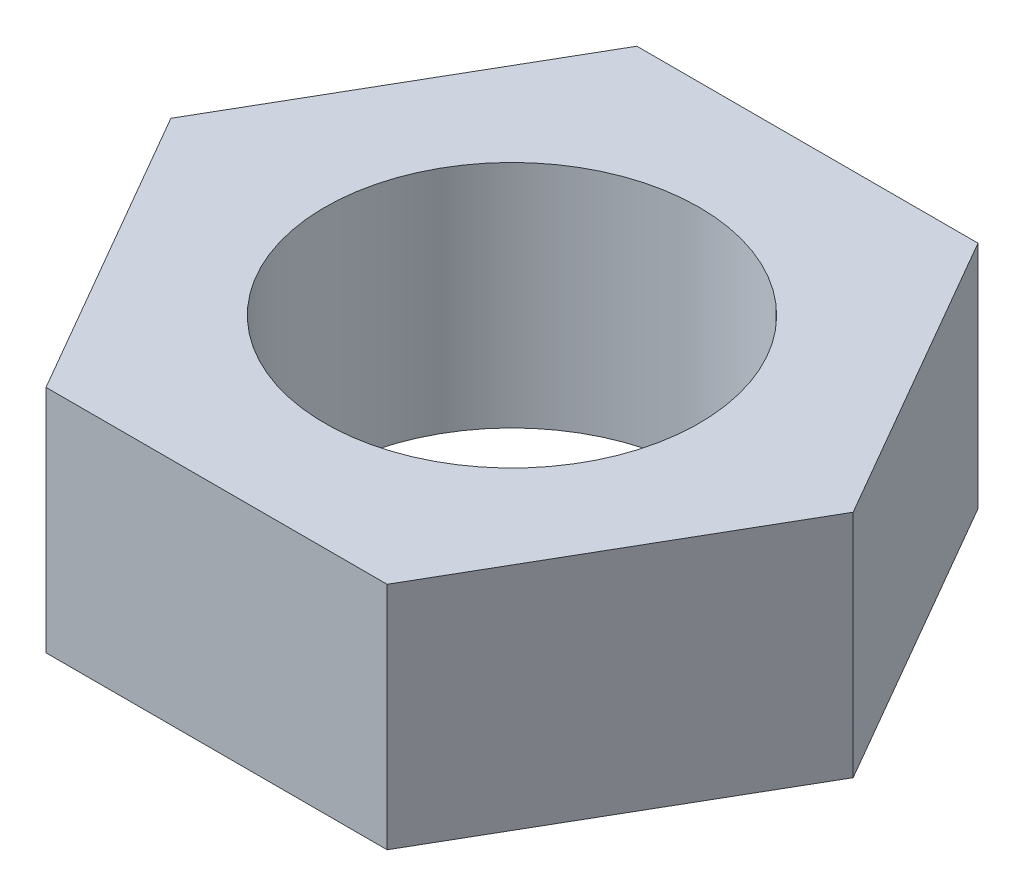
ISO-10303-21;
HEADER;
FILE_DESCRIPTION(('STEP AP214'),'2;1');
FILE_NAME('part.step','',(''),(''),'','','');
FILE_SCHEMA(('AUTOMOTIVE_DESIGN { 1 0 10303 214 1 1 1 1 }'));
ENDSEC;
DATA;
#1=APPLICATION_CONTEXT('core data for automotive mechanical design processes');
#2=APPLICATION_PROTOCOL_DEFINITION('international standard','automotive_design',2000,#1);
#3=PRODUCT_CONTEXT('',#1,'mechanical');
#4=PRODUCT('Part','Part','',(#3));
#5=PRODUCT_RELATED_PRODUCT_CATEGORY('part','',(#4));
#6=PRODUCT_DEFINITION_FORMATION('','',#4);
#7=PRODUCT_DEFINITION_CONTEXT('part definition',#1,'design');
#8=PRODUCT_DEFINITION('design','',#6,#7);
#9=PRODUCT_DEFINITION_SHAPE('','',#8);
#10=(LENGTH_UNIT() NAMED_UNIT(*) SI_UNIT(.MILLI.,.METRE.));
#11=(NAMED_UNIT(*) PLANE_ANGLE_UNIT() SI_UNIT($,.RADIAN.));
#12=(NAMED_UNIT(*) SI_UNIT($,.STERADIAN.) SOLID_ANGLE_UNIT());
#13=UNCERTAINTY_MEASURE_WITH_UNIT(LENGTH_MEASURE(1.E-05),#10,'distance_accuracy_value','');
#14=(GEOMETRIC_REPRESENTATION_CONTEXT(3) GLOBAL_UNCERTAINTY_ASSIGNED_CONTEXT((#13)) GLOBAL_UNIT_ASSIGNED_CONTEXT((#10,
#11,#12)) REPRESENTATION_CONTEXT('',''));
#15=CARTESIAN_POINT('',(0.,0.,0.));
#16=DIRECTION('',(0.,0.,1.));
#17=DIRECTION('',(1.,0.,0.));
#18=AXIS2_PLACEMENT_3D('',#15,#16,#17);
#19=CARTESIAN_POINT('',(0.,4.3,0.));
#20=DIRECTION('',(0.,1.,0.));
#21=DIRECTION('',(0.,0.,1.));
#22=AXIS2_PLACEMENT_3D('',#19,#20,#21);
#23=PLANE('',#22);
#24=DIRECTION('',(1.,0.,0.));
#25=VECTOR('',#24,1.);
#26=CARTESIAN_POINT('',(-3.18986023727268,4.3,5.525));
#27=LINE('',#26,#25);
#28=CARTESIAN_POINT('',(-3.18986023727268,4.3,5.525));
#29=VERTEX_POINT('',#28);
#30=CARTESIAN_POINT('',(3.18986023727268,4.3,5.525));
#31=VERTEX_POINT('',#30);
#32=EDGE_CURVE('E129',#29,#31,#27,.T.);
#33=ORIENTED_EDGE('',*,*,#32,.T.);
#34=DIRECTION('',(0.5,0.,-0.866025403784438));
#35=VECTOR('',#34,1.);
#36=CARTESIAN_POINT('',(3.18986023727268,4.3,5.525));
#37=LINE('',#36,#35);
#38=CARTESIAN_POINT('',(6.37972047454537,4.3,0.));
#39=VERTEX_POINT('',#38);
#40=EDGE_CURVE('E87',#31,#39,#37,.T.);
#41=ORIENTED_EDGE('',*,*,#40,.T.);
#42=DIRECTION('',(-0.5,0.,-0.866025403784438));
#43=VECTOR('',#42,1.);
#44=CARTESIAN_POINT('',(6.37972047454537,4.3,0.));
#45=LINE('',#44,#43);
#46=CARTESIAN_POINT('',(3.18986023727268,4.3,-5.525));
#47=VERTEX_POINT('',#46);
#48=EDGE_CURVE('E100',#39,#47,#45,.T.);
#49=ORIENTED_EDGE('',*,*,#48,.T.);
#50=DIRECTION('',(-1.,0.,0.));
#51=VECTOR('',#50,1.);
#52=CARTESIAN_POINT('',(3.18986023727268,4.3,-5.525));
#53=LINE('',#52,#51);
#54=CARTESIAN_POINT('',(-3.18986023727268,4.3,-5.525));
#55=VERTEX_POINT('',#54);
#56=EDGE_CURVE('E94',#47,#55,#53,.T.);
#57=ORIENTED_EDGE('',*,*,#56,.T.);
#58=DIRECTION('',(-0.5,0.,0.866025403784438));
#59=VECTOR('',#58,1.);
#60=CARTESIAN_POINT('',(-3.18986023727268,4.3,-5.525));
#61=LINE('',#60,#59);
#62=CARTESIAN_POINT('',(-6.37972047454537,4.3,0.));
#63=VERTEX_POINT('',#62);
#64=EDGE_CURVE('E98',#55,#63,#61,.T.);
#65=ORIENTED_EDGE('',*,*,#64,.T.);
#66=DIRECTION('',(0.5,0.,0.866025403784438));
#67=VECTOR('',#66,1.);
#68=CARTESIAN_POINT('',(-6.37972047454537,4.3,0.));
#69=LINE('',#68,#67);
#70=EDGE_CURVE('E50',#63,#29,#69,.T.);
#71=ORIENTED_EDGE('',*,*,#70,.T.);
#72=EDGE_LOOP('',(#33,#41,#49,#57,#65,#71));
#73=FACE_BOUND('',#72,.T.);
#74=CARTESIAN_POINT('',(0.,4.3,0.));
#75=DIRECTION('',(0.,1.,0.));
#76=DIRECTION('',(0.,0.,1.));
#77=AXIS2_PLACEMENT_3D('',#74,#75,#76);
#78=CIRCLE('',#77,3.5);
#79=CARTESIAN_POINT('',(0.,4.3,-3.5));
#80=VERTEX_POINT('',#79);
#81=EDGE_CURVE('E122',#80,#80,#78,.T.);
#82=ORIENTED_EDGE('',*,*,#81,.F.);
#83=EDGE_LOOP('',(#82));
#84=FACE_BOUND('',#83,.T.);
#85=ADVANCED_FACE('F33',(#73,#84),#23,.T.);
#86=CARTESIAN_POINT('',(0.,0.,0.));
#87=DIRECTION('',(0.,1.,0.));
#88=DIRECTION('',(0.,0.,1.));
#89=AXIS2_PLACEMENT_3D('',#86,#87,#88);
#90=PLANE('',#89);
#91=DIRECTION('',(1.,0.,0.));
#92=VECTOR('',#91,1.);
#93=CARTESIAN_POINT('',(-3.18986023727268,0.,5.525));
#94=LINE('',#93,#92);
#95=CARTESIAN_POINT('',(-3.18986023727268,0.,5.525));
#96=VERTEX_POINT('',#95);
#97=CARTESIAN_POINT('',(3.18986023727268,0.,5.525));
#98=VERTEX_POINT('',#97);
#99=EDGE_CURVE('E118',#96,#98,#94,.T.);
#100=ORIENTED_EDGE('',*,*,#99,.F.);
#101=DIRECTION('',(0.5,0.,0.866025403784438));
#102=VECTOR('',#101,1.);
#103=CARTESIAN_POINT('',(-6.37972047454537,0.,0.));
#104=LINE('',#103,#102);
#105=CARTESIAN_POINT('',(-6.37972047454537,0.,0.));
#106=VERTEX_POINT('',#105);
#107=EDGE_CURVE('E79',#106,#96,#104,.T.);
#108=ORIENTED_EDGE('',*,*,#107,.F.);
#109=DIRECTION('',(-0.5,0.,0.866025403784438));
#110=VECTOR('',#109,1.);
#111=CARTESIAN_POINT('',(-3.18986023727268,0.,-5.525));
#112=LINE('',#111,#110);
#113=CARTESIAN_POINT('',(-3.18986023727268,0.,-5.525));
#114=VERTEX_POINT('',#113);
#115=EDGE_CURVE('E73',#114,#106,#112,.T.);
#116=ORIENTED_EDGE('',*,*,#115,.F.);
#117=DIRECTION('',(-1.,0.,0.));
#118=VECTOR('',#117,1.);
#119=CARTESIAN_POINT('',(3.18986023727268,0.,-5.525));
#120=LINE('',#119,#118);
#121=CARTESIAN_POINT('',(3.18986023727268,0.,-5.525));
#122=VERTEX_POINT('',#121);
#123=EDGE_CURVE('E108',#122,#114,#120,.T.);
#124=ORIENTED_EDGE('',*,*,#123,.F.);
#125=DIRECTION('',(-0.5,0.,-0.866025403784438));
#126=VECTOR('',#125,1.);
#127=CARTESIAN_POINT('',(6.37972047454537,0.,0.));
#128=LINE('',#127,#126);
#129=CARTESIAN_POINT('',(6.37972047454537,0.,0.));
#130=VERTEX_POINT('',#129);
#131=EDGE_CURVE('E124',#130,#122,#128,.T.);
#132=ORIENTED_EDGE('',*,*,#131,.F.);
#133=DIRECTION('',(0.5,0.,-0.866025403784438));
#134=VECTOR('',#133,1.);
#135=CARTESIAN_POINT('',(3.18986023727268,0.,5.525));
#136=LINE('',#135,#134);
#137=EDGE_CURVE('E121',#98,#130,#136,.T.);
#138=ORIENTED_EDGE('',*,*,#137,.F.);
#139=EDGE_LOOP('',(#100,#108,#116,#124,#132,#138));
#140=FACE_BOUND('',#139,.T.);
#141=CARTESIAN_POINT('',(0.,0.,0.));
#142=DIRECTION('',(0.,1.,0.));
#143=DIRECTION('',(0.,0.,1.));
#144=AXIS2_PLACEMENT_3D('',#141,#142,#143);
#145=CIRCLE('',#144,3.5);
#146=CARTESIAN_POINT('',(0.,0.,-3.5));
#147=VERTEX_POINT('',#146);
#148=EDGE_CURVE('E222',#147,#147,#145,.T.);
#149=ORIENTED_EDGE('',*,*,#148,.T.);
#150=EDGE_LOOP('',(#149));
#151=FACE_BOUND('',#150,.T.);
#152=ADVANCED_FACE('F138',(#140,#151),#90,.F.);
#153=CARTESIAN_POINT('',(-3.18986023727268,4.3,5.525));
#154=DIRECTION('',(0.,0.,-1.));
#155=DIRECTION('',(-1.,0.,0.));
#156=AXIS2_PLACEMENT_3D('',#153,#154,#155);
#157=PLANE('',#156);
#158=ORIENTED_EDGE('',*,*,#99,.T.);
#159=DIRECTION('',(0.,-1.,0.));
#160=VECTOR('',#159,1.);
#161=CARTESIAN_POINT('',(3.18986023727268,4.3,5.525));
#162=LINE('',#161,#160);
#163=EDGE_CURVE('E11',#31,#98,#162,.T.);
#164=ORIENTED_EDGE('',*,*,#163,.F.);
#165=ORIENTED_EDGE('',*,*,#32,.F.);
#166=DIRECTION('',(0.,-1.,0.));
#167=VECTOR('',#166,1.);
#168=CARTESIAN_POINT('',(-3.18986023727268,4.3,5.525));
#169=LINE('',#168,#167);
#170=EDGE_CURVE('E114',#29,#96,#169,.T.);
#171=ORIENTED_EDGE('',*,*,#170,.T.);
#172=EDGE_LOOP('',(#158,#164,#165,#171));
#173=FACE_BOUND('',#172,.T.);
#174=ADVANCED_FACE('F35',(#173),#157,.F.);
#175=CARTESIAN_POINT('',(3.18986023727268,4.3,5.525));
#176=DIRECTION('',(-0.866025403784439,0.,-0.5));
#177=DIRECTION('',(-0.5,0.,0.866025403784439));
#178=AXIS2_PLACEMENT_3D('',#175,#176,#177);
#179=PLANE('',#178);
#180=ORIENTED_EDGE('',*,*,#137,.T.);
#181=DIRECTION('',(0.,-1.,0.));
#182=VECTOR('',#181,1.);
#183=CARTESIAN_POINT('',(6.37972047454537,4.3,0.));
#184=LINE('',#183,#182);
#185=EDGE_CURVE('E42',#39,#130,#184,.T.);
#186=ORIENTED_EDGE('',*,*,#185,.F.);
#187=ORIENTED_EDGE('',*,*,#40,.F.);
#188=ORIENTED_EDGE('',*,*,#163,.T.);
#189=EDGE_LOOP('',(#180,#186,#187,#188));
#190=FACE_BOUND('',#189,.T.);
#191=ADVANCED_FACE('F163',(#190),#179,.F.);
#192=CARTESIAN_POINT('',(6.37972047454537,4.3,0.));
#193=DIRECTION('',(-0.866025403784438,0.,0.5));
#194=DIRECTION('',(0.5,0.,0.866025403784439));
#195=AXIS2_PLACEMENT_3D('',#192,#193,#194);
#196=PLANE('',#195);
#197=ORIENTED_EDGE('',*,*,#131,.T.);
#198=DIRECTION('',(0.,-1.,0.));
#199=VECTOR('',#198,1.);
#200=CARTESIAN_POINT('',(3.18986023727268,4.3,-5.525));
#201=LINE('',#200,#199);
#202=EDGE_CURVE('E109',#47,#122,#201,.T.);
#203=ORIENTED_EDGE('',*,*,#202,.F.);
#204=ORIENTED_EDGE('',*,*,#48,.F.);
#205=ORIENTED_EDGE('',*,*,#185,.T.);
#206=EDGE_LOOP('',(#197,#203,#204,#205));
#207=FACE_BOUND('',#206,.T.);
#208=ADVANCED_FACE('F135',(#207),#196,.F.);
#209=CARTESIAN_POINT('',(3.18986023727268,4.3,-5.525));
#210=DIRECTION('',(0.,0.,1.));
#211=DIRECTION('',(1.,0.,0.));
#212=AXIS2_PLACEMENT_3D('',#209,#210,#211);
#213=PLANE('',#212);
#214=ORIENTED_EDGE('',*,*,#123,.T.);
#215=DIRECTION('',(0.,-1.,0.));
#216=VECTOR('',#215,1.);
#217=CARTESIAN_POINT('',(-3.18986023727268,4.3,-5.525));
#218=LINE('',#217,#216);
#219=EDGE_CURVE('E105',#55,#114,#218,.T.);
#220=ORIENTED_EDGE('',*,*,#219,.F.);
#221=ORIENTED_EDGE('',*,*,#56,.F.);
#222=ORIENTED_EDGE('',*,*,#202,.T.);
#223=EDGE_LOOP('',(#214,#220,#221,#222));
#224=FACE_BOUND('',#223,.T.);
#225=ADVANCED_FACE('F106',(#224),#213,.F.);
#226=CARTESIAN_POINT('',(-3.18986023727268,4.3,-5.525));
#227=DIRECTION('',(0.866025403784438,0.,0.5));
#228=DIRECTION('',(0.5,0.,-0.866025403784439));
#229=AXIS2_PLACEMENT_3D('',#226,#227,#228);
#230=PLANE('',#229);
#231=ORIENTED_EDGE('',*,*,#115,.T.);
#232=DIRECTION('',(0.,-1.,0.));
#233=VECTOR('',#232,1.);
#234=CARTESIAN_POINT('',(-6.37972047454537,4.3,0.));
#235=LINE('',#234,#233);
#236=EDGE_CURVE('E110',#63,#106,#235,.T.);
#237=ORIENTED_EDGE('',*,*,#236,.F.);
#238=ORIENTED_EDGE('',*,*,#64,.F.);
#239=ORIENTED_EDGE('',*,*,#219,.T.);
#240=EDGE_LOOP('',(#231,#237,#238,#239));
#241=FACE_BOUND('',#240,.T.);
#242=ADVANCED_FACE('F112',(#241),#230,.F.);
#243=CARTESIAN_POINT('',(-6.37972047454537,4.3,0.));
#244=DIRECTION('',(0.866025403784438,0.,-0.5));
#245=DIRECTION('',(-0.5,0.,-0.866025403784439));
#246=AXIS2_PLACEMENT_3D('',#243,#244,#245);
#247=PLANE('',#246);
#248=ORIENTED_EDGE('',*,*,#107,.T.);
#249=ORIENTED_EDGE('',*,*,#170,.F.);
#250=ORIENTED_EDGE('',*,*,#70,.F.);
#251=ORIENTED_EDGE('',*,*,#236,.T.);
#252=EDGE_LOOP('',(#248,#249,#250,#251));
#253=FACE_BOUND('',#252,.T.);
#254=ADVANCED_FACE('F143',(#253),#247,.F.);
#255=CARTESIAN_POINT('',(0.,4.3,0.));
#256=DIRECTION('',(0.,-1.,0.));
#257=DIRECTION('',(0.,0.,-1.));
#258=AXIS2_PLACEMENT_3D('',#255,#256,#257);
#259=CYLINDRICAL_SURFACE('',#258,3.5);
#260=CARTESIAN_POINT('',(0.,4.3,-3.5));
#261=CARTESIAN_POINT('',(0.,4.25520833333333,-3.5));
#262=CARTESIAN_POINT('',(0.,4.21041666666667,-3.5));
#263=CARTESIAN_POINT('',(0.,4.12083333333333,-3.5));
#264=CARTESIAN_POINT('',(0.,4.07604166666667,-3.5));
#265=CARTESIAN_POINT('',(0.,3.98645833333333,-3.5));
#266=CARTESIAN_POINT('',(0.,3.94166666666667,-3.5));
#267=CARTESIAN_POINT('',(0.,3.85208333333333,-3.5));
#268=CARTESIAN_POINT('',(0.,3.80729166666667,-3.5));
#269=CARTESIAN_POINT('',(0.,3.71770833333333,-3.5));
#270=CARTESIAN_POINT('',(0.,3.67291666666667,-3.5));
#271=CARTESIAN_POINT('',(0.,3.58333333333333,-3.5));
#272=CARTESIAN_POINT('',(0.,3.53854166666667,-3.5));
#273=CARTESIAN_POINT('',(0.,3.44895833333333,-3.5));
#274=CARTESIAN_POINT('',(0.,3.40416666666667,-3.5));
#275=CARTESIAN_POINT('',(0.,3.31458333333333,-3.5));
#276=CARTESIAN_POINT('',(0.,3.26979166666667,-3.5));
#277=CARTESIAN_POINT('',(0.,3.18020833333333,-3.5));
#278=CARTESIAN_POINT('',(0.,3.13541666666667,-3.5));
#279=CARTESIAN_POINT('',(0.,3.04583333333333,-3.5));
#280=CARTESIAN_POINT('',(0.,3.00104166666667,-3.5));
#281=CARTESIAN_POINT('',(0.,2.91145833333333,-3.5));
#282=CARTESIAN_POINT('',(0.,2.86666666666667,-3.5));
#283=CARTESIAN_POINT('',(0.,2.77708333333333,-3.5));
#284=CARTESIAN_POINT('',(0.,2.73229166666667,-3.5));
#285=CARTESIAN_POINT('',(0.,2.64270833333333,-3.5));
#286=CARTESIAN_POINT('',(0.,2.59791666666667,-3.5));
#287=CARTESIAN_POINT('',(0.,2.50833333333333,-3.5));
#288=CARTESIAN_POINT('',(0.,2.46354166666667,-3.5));
#289=CARTESIAN_POINT('',(0.,2.37395833333333,-3.5));
#290=CARTESIAN_POINT('',(0.,2.32916666666667,-3.5));
#291=CARTESIAN_POINT('',(0.,2.23958333333333,-3.5));
#292=CARTESIAN_POINT('',(0.,2.19479166666667,-3.5));
#293=CARTESIAN_POINT('',(0.,2.10520833333333,-3.5));
#294=CARTESIAN_POINT('',(0.,2.06041666666667,-3.5));
#295=CARTESIAN_POINT('',(0.,1.97083333333333,-3.5));
#296=CARTESIAN_POINT('',(0.,1.92604166666667,-3.5));
#297=CARTESIAN_POINT('',(0.,1.83645833333333,-3.5));
#298=CARTESIAN_POINT('',(0.,1.79166666666667,-3.5));
#299=CARTESIAN_POINT('',(0.,1.70208333333333,-3.5));
#300=CARTESIAN_POINT('',(0.,1.65729166666667,-3.5));
#301=CARTESIAN_POINT('',(0.,1.56770833333333,-3.5));
#302=CARTESIAN_POINT('',(0.,1.52291666666667,-3.5));
#303=CARTESIAN_POINT('',(0.,1.43333333333333,-3.5));
#304=CARTESIAN_POINT('',(0.,1.38854166666667,-3.5));
#305=CARTESIAN_POINT('',(0.,1.29895833333333,-3.5));
#306=CARTESIAN_POINT('',(0.,1.25416666666667,-3.5));
#307=CARTESIAN_POINT('',(0.,1.16458333333333,-3.5));
#308=CARTESIAN_POINT('',(0.,1.11979166666667,-3.5));
#309=CARTESIAN_POINT('',(0.,1.03020833333333,-3.5));
#310=CARTESIAN_POINT('',(0.,0.985416666666665,-3.5));
#311=CARTESIAN_POINT('',(0.,0.895833333333332,-3.5));
#312=CARTESIAN_POINT('',(0.,0.851041666666665,-3.5));
#313=CARTESIAN_POINT('',(0.,0.761458333333332,-3.5));
#314=CARTESIAN_POINT('',(0.,0.716666666666665,-3.5));
#315=CARTESIAN_POINT('',(0.,0.627083333333332,-3.5));
#316=CARTESIAN_POINT('',(0.,0.582291666666665,-3.5));
#317=CARTESIAN_POINT('',(0.,0.492708333333332,-3.5));
#318=CARTESIAN_POINT('',(0.,0.447916666666665,-3.5));
#319=CARTESIAN_POINT('',(0.,0.358333333333332,-3.5));
#320=CARTESIAN_POINT('',(0.,0.313541666666666,-3.5));
#321=CARTESIAN_POINT('',(0.,0.223958333333332,-3.5));
#322=CARTESIAN_POINT('',(0.,0.179166666666666,-3.5));
#323=CARTESIAN_POINT('',(0.,0.0895833333333324,-3.5));
#324=CARTESIAN_POINT('',(0.,0.0447916666666658,-3.5));
#325=CARTESIAN_POINT('',(0.,0.,-3.5));
#326=B_SPLINE_CURVE_WITH_KNOTS('',3,(#260,#261,#262,#263,#264,#265,#266,#267,#268,#269,#270,
#271,#272,#273,#274,#275,#276,#277,#278,#279,#280,#281,#282,#283,#284,#285,#286,#287,#288,#289,
#290,#291,#292,#293,#294,#295,#296,#297,#298,#299,#300,#301,#302,#303,#304,#305,#306,#307,#308,
#309,#310,#311,#312,#313,#314,#315,#316,#317,#318,#319,#320,#321,#322,#323,#324,#325),
.UNSPECIFIED.,.F.,.F.,(4,2,2,2,2,2,2,2,2,2,2,2,2,2,2,2,2,2,2,2,2,2,2,2,2,2,2,2,2,2,2,2,4),(0.,
0.134375000000001,0.268750000000001,0.403125000000001,0.537500000000001,0.671875000000001,
0.806250000000001,0.940625,1.075,1.209375,1.34375,1.478125,1.6125,1.746875,1.88125,2.015625,
2.15,2.284375,2.41875,2.553125,2.6875,2.821875,2.95625,3.090625,3.225,3.359375,3.49375,3.628125,
3.7625,3.896875,4.03125,4.165625,4.3),.UNSPECIFIED.);
#327=EDGE_CURVE('BSEAM145',#80,#147,#326,.T.);
#328=ORIENTED_EDGE('',*,*,#81,.T.);
#329=ORIENTED_EDGE('',*,*,#148,.F.);
#330=ORIENTED_EDGE('',*,*,#327,.T.);
#331=ORIENTED_EDGE('',*,*,#327,.F.);
#332=EDGE_LOOP('',(#328,#330,#329,#331));
#333=FACE_BOUND('',#332,.T.);
#334=ADVANCED_FACE('F145',(#333),#259,.F.);
#335=CLOSED_SHELL('',(#85,#152,#174,#191,#208,#225,#242,#254,#334));
#336=MANIFOLD_SOLID_BREP('B2',#335);
#337=ADVANCED_BREP_SHAPE_REPRESENTATION('',(#18,#336),#14);
#338=SHAPE_DEFINITION_REPRESENTATION(#9,#337);
ENDSEC;
END-ISO-10303-21;
